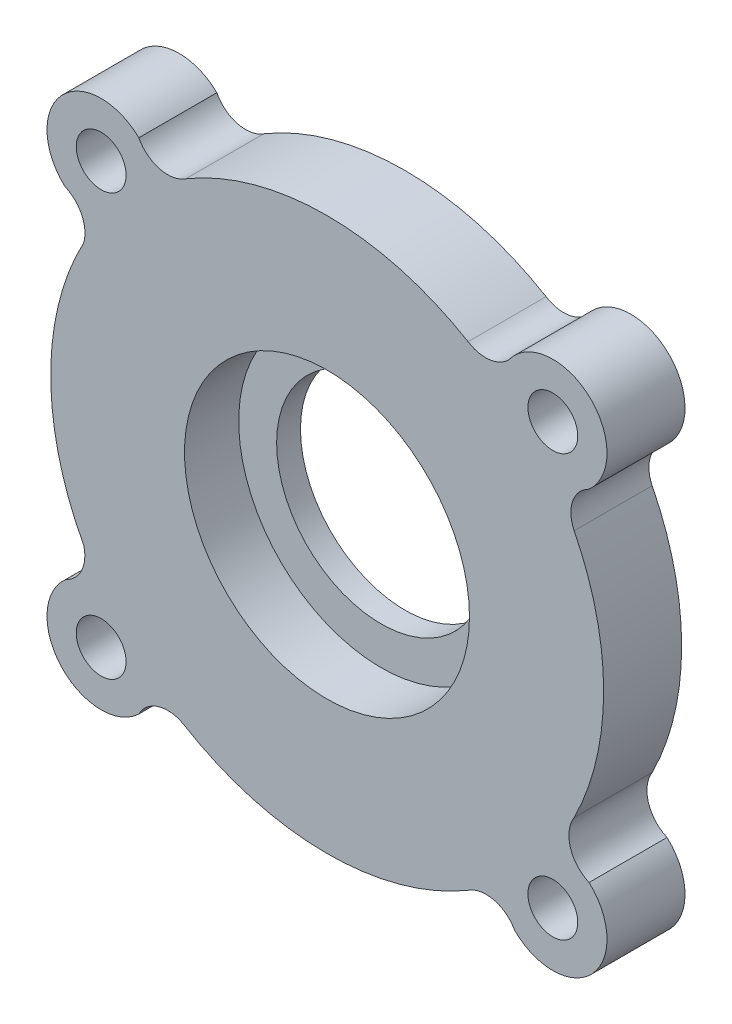
ISO-10303-21;
HEADER;
FILE_DESCRIPTION(('STEP AP214'),'2;1');
FILE_NAME('part.step','',(''),(''),'','','');
FILE_SCHEMA(('AUTOMOTIVE_DESIGN { 1 0 10303 214 1 1 1 1 }'));
ENDSEC;
DATA;
#1=APPLICATION_CONTEXT('core data for automotive mechanical design processes');
#2=APPLICATION_PROTOCOL_DEFINITION('international standard','automotive_design',2000,#1);
#3=PRODUCT_CONTEXT('',#1,'mechanical');
#4=PRODUCT('Part','Part','',(#3));
#5=PRODUCT_RELATED_PRODUCT_CATEGORY('part','',(#4));
#6=PRODUCT_DEFINITION_FORMATION('','',#4);
#7=PRODUCT_DEFINITION_CONTEXT('part definition',#1,'design');
#8=PRODUCT_DEFINITION('design','',#6,#7);
#9=PRODUCT_DEFINITION_SHAPE('','',#8);
#10=(LENGTH_UNIT() NAMED_UNIT(*) SI_UNIT(.MILLI.,.METRE.));
#11=(NAMED_UNIT(*) PLANE_ANGLE_UNIT() SI_UNIT($,.RADIAN.));
#12=(NAMED_UNIT(*) SI_UNIT($,.STERADIAN.) SOLID_ANGLE_UNIT());
#13=UNCERTAINTY_MEASURE_WITH_UNIT(LENGTH_MEASURE(1.E-05),#10,'distance_accuracy_value','');
#14=(GEOMETRIC_REPRESENTATION_CONTEXT(3) GLOBAL_UNCERTAINTY_ASSIGNED_CONTEXT((#13)) GLOBAL_UNIT_ASSIGNED_CONTEXT((#10,
#11,#12)) REPRESENTATION_CONTEXT('',''));
#15=CARTESIAN_POINT('',(0.,0.,0.));
#16=DIRECTION('',(0.,0.,1.));
#17=DIRECTION('',(1.,0.,0.));
#18=AXIS2_PLACEMENT_3D('',#15,#16,#17);
#19=CARTESIAN_POINT('',(0.,0.,7.2));
#20=DIRECTION('',(0.,0.,-1.));
#21=DIRECTION('',(-1.,0.,0.));
#22=AXIS2_PLACEMENT_3D('',#19,#20,#21);
#23=CYLINDRICAL_SURFACE('',#22,9.65);
#24=CARTESIAN_POINT('',(0.,0.,0.));
#25=DIRECTION('',(0.,0.,1.));
#26=DIRECTION('',(1.,0.,0.));
#27=AXIS2_PLACEMENT_3D('',#24,#25,#26);
#28=CIRCLE('',#27,9.65);
#29=CARTESIAN_POINT('',(9.65,0.,0.));
#30=VERTEX_POINT('',#29);
#31=EDGE_CURVE('E184',#30,#30,#28,.T.);
#32=ORIENTED_EDGE('',*,*,#31,.F.);
#33=EDGE_LOOP('',(#32));
#34=FACE_BOUND('',#33,.T.);
#35=CARTESIAN_POINT('',(0.,0.,2.2));
#36=DIRECTION('',(0.,0.,1.));
#37=DIRECTION('',(1.,0.,0.));
#38=AXIS2_PLACEMENT_3D('',#35,#36,#37);
#39=CIRCLE('',#38,9.65);
#40=CARTESIAN_POINT('',(9.65,0.,2.2));
#41=VERTEX_POINT('',#40);
#42=EDGE_CURVE('E37',#41,#41,#39,.T.);
#43=ORIENTED_EDGE('',*,*,#42,.T.);
#44=EDGE_LOOP('',(#43));
#45=FACE_BOUND('',#44,.T.);
#46=ADVANCED_FACE('F33',(#34,#45),#23,.F.);
#47=CARTESIAN_POINT('',(7.34276443322438,-12.2103392874891,7.2));
#48=DIRECTION('',(0.,0.,1.));
#49=DIRECTION('',(1.,0.,0.));
#50=AXIS2_PLACEMENT_3D('',#47,#48,#49);
#51=PLANE('',#50);
#52=CARTESIAN_POINT('',(0.,0.,7.2));
#53=DIRECTION('',(0.,0.,1.));
#54=DIRECTION('',(1.,0.,0.));
#55=AXIS2_PLACEMENT_3D('',#52,#53,#54);
#56=CIRCLE('',#55,13.15);
#57=CARTESIAN_POINT('',(13.15,0.,7.2));
#58=VERTEX_POINT('',#57);
#59=EDGE_CURVE('E457',#58,#58,#56,.T.);
#60=ORIENTED_EDGE('',*,*,#59,.F.);
#61=EDGE_LOOP('',(#60));
#62=FACE_BOUND('',#61,.T.);
#63=CARTESIAN_POINT('',(20.8435804961464,19.4369532617811,7.2));
#64=DIRECTION('',(0.,0.,1.));
#65=DIRECTION('',(1.,0.,0.));
#66=AXIS2_PLACEMENT_3D('',#63,#64,#65);
#67=CIRCLE('',#66,2.3);
#68=CARTESIAN_POINT('',(23.1435804961464,19.4369532617811,7.2));
#69=VERTEX_POINT('',#68);
#70=EDGE_CURVE('E469',#69,#69,#67,.T.);
#71=ORIENTED_EDGE('',*,*,#70,.F.);
#72=EDGE_LOOP('',(#71));
#73=FACE_BOUND('',#72,.T.);
#74=CARTESIAN_POINT('',(-20.8435804961464,-19.4369532617812,7.2));
#75=DIRECTION('',(0.,0.,1.));
#76=DIRECTION('',(1.,0.,0.));
#77=AXIS2_PLACEMENT_3D('',#74,#75,#76);
#78=CIRCLE('',#77,2.3);
#79=CARTESIAN_POINT('',(-18.5435804961464,-19.4369532617812,7.2));
#80=VERTEX_POINT('',#79);
#81=EDGE_CURVE('E481',#80,#80,#78,.T.);
#82=ORIENTED_EDGE('',*,*,#81,.F.);
#83=EDGE_LOOP('',(#82));
#84=FACE_BOUND('',#83,.T.);
#85=CARTESIAN_POINT('',(14.6855288664488,-24.4206785749781,7.2));
#86=DIRECTION('',(0.,0.,-1.));
#87=DIRECTION('',(1.,0.,0.));
#88=AXIS2_PLACEMENT_3D('',#85,#86,#87);
#89=CIRCLE('',#88,2.99999999999999);
#90=CARTESIAN_POINT('',(13.019103812311,-21.9260788998915,7.2));
#91=VERTEX_POINT('',#90);
#92=CARTESIAN_POINT('',(17.3186178935602,-22.9830269567808,7.2));
#93=VERTEX_POINT('',#92);
#94=EDGE_CURVE('E211',#91,#93,#89,.T.);
#95=ORIENTED_EDGE('',*,*,#94,.T.);
#96=CARTESIAN_POINT('',(20.8435804961464,-19.4369532617811,7.2));
#97=DIRECTION('',(0.,0.,1.));
#98=DIRECTION('',(1.,0.,0.));
#99=AXIS2_PLACEMENT_3D('',#96,#97,#98);
#100=CIRCLE('',#99,5.);
#101=CARTESIAN_POINT('',(24.1865219147143,-15.718789377278,7.2));
#102=VERTEX_POINT('',#101);
#103=EDGE_CURVE('E118',#93,#102,#100,.T.);
#104=ORIENTED_EDGE('',*,*,#103,.T.);
#105=CARTESIAN_POINT('',(25.4243940156176,-12.8782836177276,7.2));
#106=DIRECTION('',(0.,0.,-1.));
#107=DIRECTION('',(1.,0.,0.));
#108=AXIS2_PLACEMENT_3D('',#105,#106,#107);
#109=CIRCLE('',#108,3.09851582346032);
#110=CARTESIAN_POINT('',(22.8142136143577,-11.2086253948829,7.2));
#111=VERTEX_POINT('',#110);
#112=EDGE_CURVE('E251',#102,#111,#109,.T.);
#113=ORIENTED_EDGE('',*,*,#112,.T.);
#114=CARTESIAN_POINT('',(0.0333787674098179,0.249278587787173,7.2));
#115=DIRECTION('',(0.,0.,1.));
#116=DIRECTION('',(1.,0.,0.));
#117=AXIS2_PLACEMENT_3D('',#114,#115,#116);
#118=CIRCLE('',#117,25.5);
#119=CARTESIAN_POINT('',(22.8142136143577,11.7071825704573,7.2));
#120=VERTEX_POINT('',#119);
#121=EDGE_CURVE('E270',#111,#120,#118,.T.);
#122=ORIENTED_EDGE('',*,*,#121,.T.);
#123=CARTESIAN_POINT('',(25.5088228942053,13.0259247093756,7.2));
#124=DIRECTION('',(0.,0.,-1.));
#125=DIRECTION('',(1.,0.,0.));
#126=AXIS2_PLACEMENT_3D('',#123,#124,#125);
#127=CIRCLE('',#126,3.);
#128=CARTESIAN_POINT('',(24.1865219147143,15.718789377278,7.2));
#129=VERTEX_POINT('',#128);
#130=EDGE_CURVE('E267',#120,#129,#127,.T.);
#131=ORIENTED_EDGE('',*,*,#130,.T.);
#132=CARTESIAN_POINT('',(20.8435804961464,19.4369532617811,7.2));
#133=DIRECTION('',(0.,0.,1.));
#134=DIRECTION('',(1.,0.,0.));
#135=AXIS2_PLACEMENT_3D('',#132,#133,#134);
#136=CIRCLE('',#135,5.);
#137=CARTESIAN_POINT('',(16.8008499698837,22.3791174128821,7.2));
#138=VERTEX_POINT('',#137);
#139=EDGE_CURVE('E269',#129,#138,#136,.T.);
#140=ORIENTED_EDGE('',*,*,#139,.T.);
#141=CARTESIAN_POINT('',(14.6342566466709,24.4541772606479,7.2));
#142=DIRECTION('',(0.,0.,-1.));
#143=DIRECTION('',(1.,0.,0.));
#144=AXIS2_PLACEMENT_3D('',#141,#142,#143);
#145=CIRCLE('',#144,3.);
#146=CARTESIAN_POINT('',(13.019103812311,21.9260788998915,7.2));
#147=VERTEX_POINT('',#146);
#148=EDGE_CURVE('E272',#138,#147,#145,.T.);
#149=ORIENTED_EDGE('',*,*,#148,.T.);
#150=CARTESIAN_POINT('',(0.,0.,7.2));
#151=DIRECTION('',(0.,0.,1.));
#152=DIRECTION('',(1.,0.,0.));
#153=AXIS2_PLACEMENT_3D('',#150,#151,#152);
#154=CIRCLE('',#153,25.5);
#155=CARTESIAN_POINT('',(-13.019103812311,21.9260788998915,7.2));
#156=VERTEX_POINT('',#155);
#157=EDGE_CURVE('E278',#147,#156,#154,.T.);
#158=ORIENTED_EDGE('',*,*,#157,.T.);
#159=CARTESIAN_POINT('',(-14.7028304548348,24.4090337108488,7.2));
#160=DIRECTION('',(0.,0.,-1.));
#161=DIRECTION('',(1.,0.,0.));
#162=AXIS2_PLACEMENT_3D('',#159,#160,#161);
#163=CIRCLE('',#162,3.);
#164=CARTESIAN_POINT('',(-17.3676656772842,23.0311174444548,7.2));
#165=VERTEX_POINT('',#164);
#166=EDGE_CURVE('E280',#156,#165,#163,.T.);
#167=ORIENTED_EDGE('',*,*,#166,.T.);
#168=CARTESIAN_POINT('',(-20.8435804961464,19.4369532617812,7.2));
#169=DIRECTION('',(0.,0.,1.));
#170=DIRECTION('',(1.,0.,0.));
#171=AXIS2_PLACEMENT_3D('',#168,#169,#170);
#172=CIRCLE('',#171,5.);
#173=CARTESIAN_POINT('',(-24.1865219147143,15.718789377278,7.2));
#174=VERTEX_POINT('',#173);
#175=EDGE_CURVE('E282',#165,#174,#172,.T.);
#176=ORIENTED_EDGE('',*,*,#175,.T.);
#177=CARTESIAN_POINT('',(-25.3744565513042,12.923659066414,7.2));
#178=DIRECTION('',(0.,0.,-1.));
#179=DIRECTION('',(1.,0.,0.));
#180=AXIS2_PLACEMENT_3D('',#177,#178,#179);
#181=CIRCLE('',#180,3.03709436065472);
#182=CARTESIAN_POINT('',(-22.4565926968816,12.0810365634065,7.2));
#183=VERTEX_POINT('',#182);
#184=EDGE_CURVE('E284',#174,#183,#181,.T.);
#185=ORIENTED_EDGE('',*,*,#184,.T.);
#186=CARTESIAN_POINT('',(0.,0.,7.2));
#187=DIRECTION('',(0.,0.,1.));
#188=DIRECTION('',(1.,0.,0.));
#189=AXIS2_PLACEMENT_3D('',#186,#187,#188);
#190=CIRCLE('',#189,25.5);
#191=CARTESIAN_POINT('',(-22.456852874275,-12.0805529253907,7.2));
#192=VERTEX_POINT('',#191);
#193=EDGE_CURVE('E286',#183,#192,#190,.T.);
#194=ORIENTED_EDGE('',*,*,#193,.T.);
#195=CARTESIAN_POINT('',(-25.4243940156176,-12.8782836177276,7.2));
#196=DIRECTION('',(0.,0.,-1.));
#197=DIRECTION('',(1.,0.,0.));
#198=AXIS2_PLACEMENT_3D('',#195,#196,#197);
#199=CIRCLE('',#198,3.07289353591315);
#200=CARTESIAN_POINT('',(-24.1213788812351,-15.6612364097503,7.2));
#201=VERTEX_POINT('',#200);
#202=EDGE_CURVE('E162',#192,#201,#199,.T.);
#203=ORIENTED_EDGE('',*,*,#202,.T.);
#204=CARTESIAN_POINT('',(-20.8435804961464,-19.4369532617812,7.2));
#205=DIRECTION('',(0.,0.,1.));
#206=DIRECTION('',(1.,0.,0.));
#207=AXIS2_PLACEMENT_3D('',#204,#205,#206);
#208=CIRCLE('',#207,5.);
#209=CARTESIAN_POINT('',(-17.3676656772842,-23.0311174444548,7.2));
#210=VERTEX_POINT('',#209);
#211=EDGE_CURVE('E155',#201,#210,#208,.T.);
#212=ORIENTED_EDGE('',*,*,#211,.T.);
#213=CARTESIAN_POINT('',(-14.7040312563286,-24.4113535371219,7.2));
#214=DIRECTION('',(0.,0.,-1.));
#215=DIRECTION('',(1.,0.,0.));
#216=AXIS2_PLACEMENT_3D('',#213,#214,#215);
#217=CIRCLE('',#216,3.);
#218=CARTESIAN_POINT('',(-13.2509251729815,-21.7867616239781,7.2));
#219=VERTEX_POINT('',#218);
#220=EDGE_CURVE('E160',#210,#219,#217,.T.);
#221=ORIENTED_EDGE('',*,*,#220,.T.);
#222=CARTESIAN_POINT('',(0.,0.,7.2));
#223=DIRECTION('',(0.,0.,1.));
#224=DIRECTION('',(1.,0.,0.));
#225=AXIS2_PLACEMENT_3D('',#222,#223,#224);
#226=CIRCLE('',#225,25.5);
#227=EDGE_CURVE('E51',#219,#91,#226,.T.);
#228=ORIENTED_EDGE('',*,*,#227,.T.);
#229=EDGE_LOOP('',(#95,#104,#113,#122,#131,#140,#149,#158,#167,#176,#185,#194,#203,#212,#221,#228));
#230=FACE_BOUND('',#229,.T.);
#231=CARTESIAN_POINT('',(20.8435804961464,-19.4369532617811,7.2));
#232=DIRECTION('',(0.,0.,1.));
#233=DIRECTION('',(1.,0.,0.));
#234=AXIS2_PLACEMENT_3D('',#231,#232,#233);
#235=CIRCLE('',#234,2.3);
#236=CARTESIAN_POINT('',(23.1435804961464,-19.4369532617811,7.2));
#237=VERTEX_POINT('',#236);
#238=EDGE_CURVE('E475',#237,#237,#235,.T.);
#239=ORIENTED_EDGE('',*,*,#238,.F.);
#240=EDGE_LOOP('',(#239));
#241=FACE_BOUND('',#240,.T.);
#242=CARTESIAN_POINT('',(-20.8435804961464,19.4369532617812,7.2));
#243=DIRECTION('',(0.,0.,1.));
#244=DIRECTION('',(1.,0.,0.));
#245=AXIS2_PLACEMENT_3D('',#242,#243,#244);
#246=CIRCLE('',#245,2.3);
#247=CARTESIAN_POINT('',(-18.5435804961464,19.4369532617812,7.2));
#248=VERTEX_POINT('',#247);
#249=EDGE_CURVE('E463',#248,#248,#246,.T.);
#250=ORIENTED_EDGE('',*,*,#249,.F.);
#251=EDGE_LOOP('',(#250));
#252=FACE_BOUND('',#251,.T.);
#253=ADVANCED_FACE('F157',(#62,#73,#84,#230,#241,#252),#51,.T.);
#254=CARTESIAN_POINT('',(7.34276443322438,-12.2103392874891,0.));
#255=DIRECTION('',(0.,0.,1.));
#256=DIRECTION('',(1.,0.,0.));
#257=AXIS2_PLACEMENT_3D('',#254,#255,#256);
#258=PLANE('',#257);
#259=CARTESIAN_POINT('',(14.6855288664488,-24.4206785749781,0.));
#260=DIRECTION('',(0.,0.,-1.));
#261=DIRECTION('',(1.,0.,0.));
#262=AXIS2_PLACEMENT_3D('',#259,#260,#261);
#263=CIRCLE('',#262,2.99999999999999);
#264=CARTESIAN_POINT('',(13.019103812311,-21.9260788998915,0.));
#265=VERTEX_POINT('',#264);
#266=CARTESIAN_POINT('',(17.3186178935602,-22.9830269567808,0.));
#267=VERTEX_POINT('',#266);
#268=EDGE_CURVE('E180',#265,#267,#263,.T.);
#269=ORIENTED_EDGE('',*,*,#268,.F.);
#270=CARTESIAN_POINT('',(0.,0.,0.));
#271=DIRECTION('',(0.,0.,1.));
#272=DIRECTION('',(1.,0.,0.));
#273=AXIS2_PLACEMENT_3D('',#270,#271,#272);
#274=CIRCLE('',#273,25.5);
#275=CARTESIAN_POINT('',(-13.2509251729815,-21.7867616239781,0.));
#276=VERTEX_POINT('',#275);
#277=EDGE_CURVE('E110',#276,#265,#274,.T.);
#278=ORIENTED_EDGE('',*,*,#277,.F.);
#279=CARTESIAN_POINT('',(-14.7040312563286,-24.4113535371219,0.));
#280=DIRECTION('',(0.,0.,-1.));
#281=DIRECTION('',(1.,0.,0.));
#282=AXIS2_PLACEMENT_3D('',#279,#280,#281);
#283=CIRCLE('',#282,3.);
#284=CARTESIAN_POINT('',(-17.3676656772842,-23.0311174444548,0.));
#285=VERTEX_POINT('',#284);
#286=EDGE_CURVE('E104',#285,#276,#283,.T.);
#287=ORIENTED_EDGE('',*,*,#286,.F.);
#288=CARTESIAN_POINT('',(-20.8435804961464,-19.4369532617812,0.));
#289=DIRECTION('',(0.,0.,1.));
#290=DIRECTION('',(1.,0.,0.));
#291=AXIS2_PLACEMENT_3D('',#288,#289,#290);
#292=CIRCLE('',#291,5.);
#293=CARTESIAN_POINT('',(-24.1213788812351,-15.6612364097503,0.));
#294=VERTEX_POINT('',#293);
#295=EDGE_CURVE('E170',#294,#285,#292,.T.);
#296=ORIENTED_EDGE('',*,*,#295,.F.);
#297=CARTESIAN_POINT('',(-25.4243940156176,-12.8782836177276,0.));
#298=DIRECTION('',(0.,0.,-1.));
#299=DIRECTION('',(1.,0.,0.));
#300=AXIS2_PLACEMENT_3D('',#297,#298,#299);
#301=CIRCLE('',#300,3.07289353591315);
#302=CARTESIAN_POINT('',(-22.456852874275,-12.0805529253907,0.));
#303=VERTEX_POINT('',#302);
#304=EDGE_CURVE('E206',#303,#294,#301,.T.);
#305=ORIENTED_EDGE('',*,*,#304,.F.);
#306=CARTESIAN_POINT('',(0.,0.,0.));
#307=DIRECTION('',(0.,0.,1.));
#308=DIRECTION('',(1.,0.,0.));
#309=AXIS2_PLACEMENT_3D('',#306,#307,#308);
#310=CIRCLE('',#309,25.5);
#311=CARTESIAN_POINT('',(-22.4565926968816,12.0810365634065,0.));
#312=VERTEX_POINT('',#311);
#313=EDGE_CURVE('E204',#312,#303,#310,.T.);
#314=ORIENTED_EDGE('',*,*,#313,.F.);
#315=CARTESIAN_POINT('',(-25.3744565513042,12.923659066414,0.));
#316=DIRECTION('',(0.,0.,-1.));
#317=DIRECTION('',(1.,0.,0.));
#318=AXIS2_PLACEMENT_3D('',#315,#316,#317);
#319=CIRCLE('',#318,3.03709436065472);
#320=CARTESIAN_POINT('',(-24.1865219147143,15.718789377278,0.));
#321=VERTEX_POINT('',#320);
#322=EDGE_CURVE('E202',#321,#312,#319,.T.);
#323=ORIENTED_EDGE('',*,*,#322,.F.);
#324=CARTESIAN_POINT('',(-20.8435804961464,19.4369532617812,0.));
#325=DIRECTION('',(0.,0.,1.));
#326=DIRECTION('',(1.,0.,0.));
#327=AXIS2_PLACEMENT_3D('',#324,#325,#326);
#328=CIRCLE('',#327,5.);
#329=CARTESIAN_POINT('',(-17.3676656772842,23.0311174444548,0.));
#330=VERTEX_POINT('',#329);
#331=EDGE_CURVE('E200',#330,#321,#328,.T.);
#332=ORIENTED_EDGE('',*,*,#331,.F.);
#333=CARTESIAN_POINT('',(-14.7028304548348,24.4090337108488,0.));
#334=DIRECTION('',(0.,0.,-1.));
#335=DIRECTION('',(1.,0.,0.));
#336=AXIS2_PLACEMENT_3D('',#333,#334,#335);
#337=CIRCLE('',#336,3.);
#338=CARTESIAN_POINT('',(-13.019103812311,21.9260788998915,0.));
#339=VERTEX_POINT('',#338);
#340=EDGE_CURVE('E198',#339,#330,#337,.T.);
#341=ORIENTED_EDGE('',*,*,#340,.F.);
#342=CARTESIAN_POINT('',(0.,0.,0.));
#343=DIRECTION('',(0.,0.,1.));
#344=DIRECTION('',(1.,0.,0.));
#345=AXIS2_PLACEMENT_3D('',#342,#343,#344);
#346=CIRCLE('',#345,25.5);
#347=CARTESIAN_POINT('',(13.019103812311,21.9260788998915,0.));
#348=VERTEX_POINT('',#347);
#349=EDGE_CURVE('E196',#348,#339,#346,.T.);
#350=ORIENTED_EDGE('',*,*,#349,.F.);
#351=CARTESIAN_POINT('',(14.6342566466709,24.4541772606479,0.));
#352=DIRECTION('',(0.,0.,-1.));
#353=DIRECTION('',(1.,0.,0.));
#354=AXIS2_PLACEMENT_3D('',#351,#352,#353);
#355=CIRCLE('',#354,3.);
#356=CARTESIAN_POINT('',(16.8008499698837,22.3791174128821,0.));
#357=VERTEX_POINT('',#356);
#358=EDGE_CURVE('E194',#357,#348,#355,.T.);
#359=ORIENTED_EDGE('',*,*,#358,.F.);
#360=CARTESIAN_POINT('',(20.8435804961464,19.4369532617811,0.));
#361=DIRECTION('',(0.,0.,1.));
#362=DIRECTION('',(1.,0.,0.));
#363=AXIS2_PLACEMENT_3D('',#360,#361,#362);
#364=CIRCLE('',#363,5.);
#365=CARTESIAN_POINT('',(24.1865219147143,15.718789377278,0.));
#366=VERTEX_POINT('',#365);
#367=EDGE_CURVE('E192',#366,#357,#364,.T.);
#368=ORIENTED_EDGE('',*,*,#367,.F.);
#369=CARTESIAN_POINT('',(25.5088228942053,13.0259247093756,0.));
#370=DIRECTION('',(0.,0.,-1.));
#371=DIRECTION('',(1.,0.,0.));
#372=AXIS2_PLACEMENT_3D('',#369,#370,#371);
#373=CIRCLE('',#372,3.);
#374=CARTESIAN_POINT('',(22.8142136143577,11.7071825704573,0.));
#375=VERTEX_POINT('',#374);
#376=EDGE_CURVE('E190',#375,#366,#373,.T.);
#377=ORIENTED_EDGE('',*,*,#376,.F.);
#378=CARTESIAN_POINT('',(0.0333787674098179,0.249278587787173,0.));
#379=DIRECTION('',(0.,0.,1.));
#380=DIRECTION('',(1.,0.,0.));
#381=AXIS2_PLACEMENT_3D('',#378,#379,#380);
#382=CIRCLE('',#381,25.5);
#383=CARTESIAN_POINT('',(22.8142136143577,-11.2086253948829,0.));
#384=VERTEX_POINT('',#383);
#385=EDGE_CURVE('E188',#384,#375,#382,.T.);
#386=ORIENTED_EDGE('',*,*,#385,.F.);
#387=CARTESIAN_POINT('',(25.4243940156176,-12.8782836177276,0.));
#388=DIRECTION('',(0.,0.,-1.));
#389=DIRECTION('',(1.,0.,0.));
#390=AXIS2_PLACEMENT_3D('',#387,#388,#389);
#391=CIRCLE('',#390,3.09851582346032);
#392=CARTESIAN_POINT('',(24.1865219147143,-15.718789377278,0.));
#393=VERTEX_POINT('',#392);
#394=EDGE_CURVE('E186',#393,#384,#391,.T.);
#395=ORIENTED_EDGE('',*,*,#394,.F.);
#396=CARTESIAN_POINT('',(20.8435804961464,-19.4369532617811,0.));
#397=DIRECTION('',(0.,0.,1.));
#398=DIRECTION('',(1.,0.,0.));
#399=AXIS2_PLACEMENT_3D('',#396,#397,#398);
#400=CIRCLE('',#399,5.);
#401=EDGE_CURVE('E183',#267,#393,#400,.T.);
#402=ORIENTED_EDGE('',*,*,#401,.F.);
#403=EDGE_LOOP('',(#269,#278,#287,#296,#305,#314,#323,#332,#341,#350,#359,#368,#377,#386,#395,#402));
#404=FACE_BOUND('',#403,.T.);
#405=ORIENTED_EDGE('',*,*,#31,.T.);
#406=EDGE_LOOP('',(#405));
#407=FACE_BOUND('',#406,.T.);
#408=CARTESIAN_POINT('',(-20.8435804961464,-19.4369532617812,0.));
#409=DIRECTION('',(0.,0.,1.));
#410=DIRECTION('',(1.,0.,0.));
#411=AXIS2_PLACEMENT_3D('',#408,#409,#410);
#412=CIRCLE('',#411,2.3);
#413=CARTESIAN_POINT('',(-18.5435804961464,-19.4369532617812,0.));
#414=VERTEX_POINT('',#413);
#415=EDGE_CURVE('E478',#414,#414,#412,.T.);
#416=ORIENTED_EDGE('',*,*,#415,.T.);
#417=EDGE_LOOP('',(#416));
#418=FACE_BOUND('',#417,.T.);
#419=CARTESIAN_POINT('',(20.8435804961464,-19.4369532617811,0.));
#420=DIRECTION('',(0.,0.,1.));
#421=DIRECTION('',(1.,0.,0.));
#422=AXIS2_PLACEMENT_3D('',#419,#420,#421);
#423=CIRCLE('',#422,2.3);
#424=CARTESIAN_POINT('',(23.1435804961464,-19.4369532617811,0.));
#425=VERTEX_POINT('',#424);
#426=EDGE_CURVE('E472',#425,#425,#423,.T.);
#427=ORIENTED_EDGE('',*,*,#426,.T.);
#428=EDGE_LOOP('',(#427));
#429=FACE_BOUND('',#428,.T.);
#430=CARTESIAN_POINT('',(20.8435804961464,19.4369532617811,0.));
#431=DIRECTION('',(0.,0.,1.));
#432=DIRECTION('',(1.,0.,0.));
#433=AXIS2_PLACEMENT_3D('',#430,#431,#432);
#434=CIRCLE('',#433,2.3);
#435=CARTESIAN_POINT('',(23.1435804961464,19.4369532617811,0.));
#436=VERTEX_POINT('',#435);
#437=EDGE_CURVE('E466',#436,#436,#434,.T.);
#438=ORIENTED_EDGE('',*,*,#437,.T.);
#439=EDGE_LOOP('',(#438));
#440=FACE_BOUND('',#439,.T.);
#441=CARTESIAN_POINT('',(-20.8435804961464,19.4369532617812,0.));
#442=DIRECTION('',(0.,0.,1.));
#443=DIRECTION('',(1.,0.,0.));
#444=AXIS2_PLACEMENT_3D('',#441,#442,#443);
#445=CIRCLE('',#444,2.3);
#446=CARTESIAN_POINT('',(-18.5435804961464,19.4369532617812,0.));
#447=VERTEX_POINT('',#446);
#448=EDGE_CURVE('E459',#447,#447,#445,.T.);
#449=ORIENTED_EDGE('',*,*,#448,.T.);
#450=EDGE_LOOP('',(#449));
#451=FACE_BOUND('',#450,.T.);
#452=ADVANCED_FACE('F255',(#404,#407,#418,#429,#440,#451),#258,.F.);
#453=CARTESIAN_POINT('',(14.6855288664488,-24.4206785749781,7.2));
#454=DIRECTION('',(0.,0.,-1.));
#455=DIRECTION('',(-1.,0.,0.));
#456=AXIS2_PLACEMENT_3D('',#453,#454,#455);
#457=CYLINDRICAL_SURFACE('',#456,2.99999999999999);
#458=ORIENTED_EDGE('',*,*,#268,.T.);
#459=DIRECTION('',(0.,0.,-1.));
#460=VECTOR('',#459,1.);
#461=CARTESIAN_POINT('',(17.3186178935602,-22.9830269567808,7.2));
#462=LINE('',#461,#460);
#463=EDGE_CURVE('E11',#93,#267,#462,.T.);
#464=ORIENTED_EDGE('',*,*,#463,.F.);
#465=ORIENTED_EDGE('',*,*,#94,.F.);
#466=DIRECTION('',(0.,0.,-1.));
#467=VECTOR('',#466,1.);
#468=CARTESIAN_POINT('',(13.019103812311,-21.9260788998915,7.2));
#469=LINE('',#468,#467);
#470=EDGE_CURVE('E176',#91,#265,#469,.T.);
#471=ORIENTED_EDGE('',*,*,#470,.T.);
#472=EDGE_LOOP('',(#458,#464,#465,#471));
#473=FACE_BOUND('',#472,.T.);
#474=ADVANCED_FACE('F35',(#473),#457,.F.);
#475=CARTESIAN_POINT('',(20.8435804961464,-19.4369532617811,7.2));
#476=DIRECTION('',(0.,0.,-1.));
#477=DIRECTION('',(-1.,0.,0.));
#478=AXIS2_PLACEMENT_3D('',#475,#476,#477);
#479=CYLINDRICAL_SURFACE('',#478,5.);
#480=ORIENTED_EDGE('',*,*,#401,.T.);
#481=DIRECTION('',(0.,0.,-1.));
#482=VECTOR('',#481,1.);
#483=CARTESIAN_POINT('',(24.1865219147143,-15.718789377278,7.2));
#484=LINE('',#483,#482);
#485=EDGE_CURVE('E43',#102,#393,#484,.T.);
#486=ORIENTED_EDGE('',*,*,#485,.F.);
#487=ORIENTED_EDGE('',*,*,#103,.F.);
#488=ORIENTED_EDGE('',*,*,#463,.T.);
#489=EDGE_LOOP('',(#480,#486,#487,#488));
#490=FACE_BOUND('',#489,.T.);
#491=ADVANCED_FACE('F328',(#490),#479,.T.);
#492=CARTESIAN_POINT('',(25.4243940156176,-12.8782836177276,7.2));
#493=DIRECTION('',(0.,0.,-1.));
#494=DIRECTION('',(-1.,0.,0.));
#495=AXIS2_PLACEMENT_3D('',#492,#493,#494);
#496=CYLINDRICAL_SURFACE('',#495,3.09851582346032);
#497=ORIENTED_EDGE('',*,*,#394,.T.);
#498=DIRECTION('',(0.,0.,-1.));
#499=VECTOR('',#498,1.);
#500=CARTESIAN_POINT('',(22.8142136143577,-11.2086253948829,7.2));
#501=LINE('',#500,#499);
#502=EDGE_CURVE('E242',#111,#384,#501,.T.);
#503=ORIENTED_EDGE('',*,*,#502,.F.);
#504=ORIENTED_EDGE('',*,*,#112,.F.);
#505=ORIENTED_EDGE('',*,*,#485,.T.);
#506=EDGE_LOOP('',(#497,#503,#504,#505));
#507=FACE_BOUND('',#506,.T.);
#508=ADVANCED_FACE('F249',(#507),#496,.F.);
#509=CARTESIAN_POINT('',(0.0333787674098179,0.249278587787173,7.2));
#510=DIRECTION('',(0.,0.,-1.));
#511=DIRECTION('',(-1.,0.,0.));
#512=AXIS2_PLACEMENT_3D('',#509,#510,#511);
#513=CYLINDRICAL_SURFACE('',#512,25.5);
#514=ORIENTED_EDGE('',*,*,#385,.T.);
#515=DIRECTION('',(0.,0.,-1.));
#516=VECTOR('',#515,1.);
#517=CARTESIAN_POINT('',(22.8142136143577,11.7071825704573,7.2));
#518=LINE('',#517,#516);
#519=EDGE_CURVE('E239',#120,#375,#518,.T.);
#520=ORIENTED_EDGE('',*,*,#519,.F.);
#521=ORIENTED_EDGE('',*,*,#121,.F.);
#522=ORIENTED_EDGE('',*,*,#502,.T.);
#523=EDGE_LOOP('',(#514,#520,#521,#522));
#524=FACE_BOUND('',#523,.T.);
#525=ADVANCED_FACE('F261',(#524),#513,.T.);
#526=CARTESIAN_POINT('',(25.5088228942053,13.0259247093756,7.2));
#527=DIRECTION('',(0.,0.,-1.));
#528=DIRECTION('',(-1.,0.,0.));
#529=AXIS2_PLACEMENT_3D('',#526,#527,#528);
#530=CYLINDRICAL_SURFACE('',#529,3.);
#531=ORIENTED_EDGE('',*,*,#376,.T.);
#532=DIRECTION('',(0.,0.,-1.));
#533=VECTOR('',#532,1.);
#534=CARTESIAN_POINT('',(24.1865219147143,15.718789377278,7.2));
#535=LINE('',#534,#533);
#536=EDGE_CURVE('E236',#129,#366,#535,.T.);
#537=ORIENTED_EDGE('',*,*,#536,.F.);
#538=ORIENTED_EDGE('',*,*,#130,.F.);
#539=ORIENTED_EDGE('',*,*,#519,.T.);
#540=EDGE_LOOP('',(#531,#537,#538,#539));
#541=FACE_BOUND('',#540,.T.);
#542=ADVANCED_FACE('F265',(#541),#530,.F.);
#543=CARTESIAN_POINT('',(20.8435804961464,19.4369532617811,7.2));
#544=DIRECTION('',(0.,0.,-1.));
#545=DIRECTION('',(-1.,0.,0.));
#546=AXIS2_PLACEMENT_3D('',#543,#544,#545);
#547=CYLINDRICAL_SURFACE('',#546,5.);
#548=ORIENTED_EDGE('',*,*,#367,.T.);
#549=DIRECTION('',(0.,0.,-1.));
#550=VECTOR('',#549,1.);
#551=CARTESIAN_POINT('',(16.8008499698837,22.3791174128821,7.2));
#552=LINE('',#551,#550);
#553=EDGE_CURVE('E233',#138,#357,#552,.T.);
#554=ORIENTED_EDGE('',*,*,#553,.F.);
#555=ORIENTED_EDGE('',*,*,#139,.F.);
#556=ORIENTED_EDGE('',*,*,#536,.T.);
#557=EDGE_LOOP('',(#548,#554,#555,#556));
#558=FACE_BOUND('',#557,.T.);
#559=ADVANCED_FACE('F341',(#558),#547,.T.);
#560=CARTESIAN_POINT('',(14.6342566466709,24.4541772606479,7.2));
#561=DIRECTION('',(0.,0.,-1.));
#562=DIRECTION('',(-1.,0.,0.));
#563=AXIS2_PLACEMENT_3D('',#560,#561,#562);
#564=CYLINDRICAL_SURFACE('',#563,3.);
#565=ORIENTED_EDGE('',*,*,#358,.T.);
#566=DIRECTION('',(0.,0.,-1.));
#567=VECTOR('',#566,1.);
#568=CARTESIAN_POINT('',(13.019103812311,21.9260788998915,7.2));
#569=LINE('',#568,#567);
#570=EDGE_CURVE('E230',#147,#348,#569,.T.);
#571=ORIENTED_EDGE('',*,*,#570,.F.);
#572=ORIENTED_EDGE('',*,*,#148,.F.);
#573=ORIENTED_EDGE('',*,*,#553,.T.);
#574=EDGE_LOOP('',(#565,#571,#572,#573));
#575=FACE_BOUND('',#574,.T.);
#576=ADVANCED_FACE('F344',(#575),#564,.F.);
#577=CARTESIAN_POINT('',(0.,0.,7.2));
#578=DIRECTION('',(0.,0.,-1.));
#579=DIRECTION('',(-1.,0.,0.));
#580=AXIS2_PLACEMENT_3D('',#577,#578,#579);
#581=CYLINDRICAL_SURFACE('',#580,25.5);
#582=ORIENTED_EDGE('',*,*,#349,.T.);
#583=DIRECTION('',(0.,0.,-1.));
#584=VECTOR('',#583,1.);
#585=CARTESIAN_POINT('',(-13.019103812311,21.9260788998915,7.2));
#586=LINE('',#585,#584);
#587=EDGE_CURVE('E227',#156,#339,#586,.T.);
#588=ORIENTED_EDGE('',*,*,#587,.F.);
#589=ORIENTED_EDGE('',*,*,#157,.F.);
#590=ORIENTED_EDGE('',*,*,#570,.T.);
#591=EDGE_LOOP('',(#582,#588,#589,#590));
#592=FACE_BOUND('',#591,.T.);
#593=ADVANCED_FACE('F348',(#592),#581,.T.);
#594=CARTESIAN_POINT('',(-14.7028304548348,24.4090337108488,7.2));
#595=DIRECTION('',(0.,0.,-1.));
#596=DIRECTION('',(-1.,0.,0.));
#597=AXIS2_PLACEMENT_3D('',#594,#595,#596);
#598=CYLINDRICAL_SURFACE('',#597,3.);
#599=ORIENTED_EDGE('',*,*,#340,.T.);
#600=DIRECTION('',(0.,0.,-1.));
#601=VECTOR('',#600,1.);
#602=CARTESIAN_POINT('',(-17.3676656772842,23.0311174444548,7.2));
#603=LINE('',#602,#601);
#604=EDGE_CURVE('E224',#165,#330,#603,.T.);
#605=ORIENTED_EDGE('',*,*,#604,.F.);
#606=ORIENTED_EDGE('',*,*,#166,.F.);
#607=ORIENTED_EDGE('',*,*,#587,.T.);
#608=EDGE_LOOP('',(#599,#605,#606,#607));
#609=FACE_BOUND('',#608,.T.);
#610=ADVANCED_FACE('F352',(#609),#598,.F.);
#611=CARTESIAN_POINT('',(-20.8435804961464,19.4369532617812,7.2));
#612=DIRECTION('',(0.,0.,-1.));
#613=DIRECTION('',(-1.,0.,0.));
#614=AXIS2_PLACEMENT_3D('',#611,#612,#613);
#615=CYLINDRICAL_SURFACE('',#614,5.);
#616=ORIENTED_EDGE('',*,*,#331,.T.);
#617=DIRECTION('',(0.,0.,-1.));
#618=VECTOR('',#617,1.);
#619=CARTESIAN_POINT('',(-24.1865219147143,15.718789377278,7.2));
#620=LINE('',#619,#618);
#621=EDGE_CURVE('E221',#174,#321,#620,.T.);
#622=ORIENTED_EDGE('',*,*,#621,.F.);
#623=ORIENTED_EDGE('',*,*,#175,.F.);
#624=ORIENTED_EDGE('',*,*,#604,.T.);
#625=EDGE_LOOP('',(#616,#622,#623,#624));
#626=FACE_BOUND('',#625,.T.);
#627=ADVANCED_FACE('F356',(#626),#615,.T.);
#628=CARTESIAN_POINT('',(-25.3744565513042,12.923659066414,7.2));
#629=DIRECTION('',(0.,0.,-1.));
#630=DIRECTION('',(-1.,0.,0.));
#631=AXIS2_PLACEMENT_3D('',#628,#629,#630);
#632=CYLINDRICAL_SURFACE('',#631,3.03709436065472);
#633=ORIENTED_EDGE('',*,*,#322,.T.);
#634=DIRECTION('',(0.,0.,-1.));
#635=VECTOR('',#634,1.);
#636=CARTESIAN_POINT('',(-22.4565926968816,12.0810365634065,7.2));
#637=LINE('',#636,#635);
#638=EDGE_CURVE('E218',#183,#312,#637,.T.);
#639=ORIENTED_EDGE('',*,*,#638,.F.);
#640=ORIENTED_EDGE('',*,*,#184,.F.);
#641=ORIENTED_EDGE('',*,*,#621,.T.);
#642=EDGE_LOOP('',(#633,#639,#640,#641));
#643=FACE_BOUND('',#642,.T.);
#644=ADVANCED_FACE('F360',(#643),#632,.F.);
#645=CARTESIAN_POINT('',(0.,0.,7.2));
#646=DIRECTION('',(0.,0.,-1.));
#647=DIRECTION('',(-1.,0.,0.));
#648=AXIS2_PLACEMENT_3D('',#645,#646,#647);
#649=CYLINDRICAL_SURFACE('',#648,25.5);
#650=ORIENTED_EDGE('',*,*,#313,.T.);
#651=DIRECTION('',(0.,0.,-1.));
#652=VECTOR('',#651,1.);
#653=CARTESIAN_POINT('',(-22.456852874275,-12.0805529253907,7.2));
#654=LINE('',#653,#652);
#655=EDGE_CURVE('E215',#192,#303,#654,.T.);
#656=ORIENTED_EDGE('',*,*,#655,.F.);
#657=ORIENTED_EDGE('',*,*,#193,.F.);
#658=ORIENTED_EDGE('',*,*,#638,.T.);
#659=EDGE_LOOP('',(#650,#656,#657,#658));
#660=FACE_BOUND('',#659,.T.);
#661=ADVANCED_FACE('F292',(#660),#649,.T.);
#662=CARTESIAN_POINT('',(-25.4243940156176,-12.8782836177276,7.2));
#663=DIRECTION('',(0.,0.,-1.));
#664=DIRECTION('',(-1.,0.,0.));
#665=AXIS2_PLACEMENT_3D('',#662,#663,#664);
#666=CYLINDRICAL_SURFACE('',#665,3.07289353591315);
#667=ORIENTED_EDGE('',*,*,#304,.T.);
#668=DIRECTION('',(0.,0.,-1.));
#669=VECTOR('',#668,1.);
#670=CARTESIAN_POINT('',(-24.1213788812351,-15.6612364097503,7.2));
#671=LINE('',#670,#669);
#672=EDGE_CURVE('E171',#201,#294,#671,.T.);
#673=ORIENTED_EDGE('',*,*,#672,.F.);
#674=ORIENTED_EDGE('',*,*,#202,.F.);
#675=ORIENTED_EDGE('',*,*,#655,.T.);
#676=EDGE_LOOP('',(#667,#673,#674,#675));
#677=FACE_BOUND('',#676,.T.);
#678=ADVANCED_FACE('F296',(#677),#666,.F.);
#679=CARTESIAN_POINT('',(-20.8435804961464,-19.4369532617812,7.2));
#680=DIRECTION('',(0.,0.,-1.));
#681=DIRECTION('',(-1.,0.,0.));
#682=AXIS2_PLACEMENT_3D('',#679,#680,#681);
#683=CYLINDRICAL_SURFACE('',#682,5.);
#684=ORIENTED_EDGE('',*,*,#295,.T.);
#685=DIRECTION('',(0.,0.,-1.));
#686=VECTOR('',#685,1.);
#687=CARTESIAN_POINT('',(-17.3676656772842,-23.0311174444548,7.2));
#688=LINE('',#687,#686);
#689=EDGE_CURVE('E167',#210,#285,#688,.T.);
#690=ORIENTED_EDGE('',*,*,#689,.F.);
#691=ORIENTED_EDGE('',*,*,#211,.F.);
#692=ORIENTED_EDGE('',*,*,#672,.T.);
#693=EDGE_LOOP('',(#684,#690,#691,#692));
#694=FACE_BOUND('',#693,.T.);
#695=ADVANCED_FACE('F168',(#694),#683,.T.);
#696=CARTESIAN_POINT('',(-14.7040312563286,-24.4113535371219,7.2));
#697=DIRECTION('',(0.,0.,-1.));
#698=DIRECTION('',(-1.,0.,0.));
#699=AXIS2_PLACEMENT_3D('',#696,#697,#698);
#700=CYLINDRICAL_SURFACE('',#699,3.);
#701=ORIENTED_EDGE('',*,*,#286,.T.);
#702=DIRECTION('',(0.,0.,-1.));
#703=VECTOR('',#702,1.);
#704=CARTESIAN_POINT('',(-13.2509251729815,-21.7867616239781,7.2));
#705=LINE('',#704,#703);
#706=EDGE_CURVE('E172',#219,#276,#705,.T.);
#707=ORIENTED_EDGE('',*,*,#706,.F.);
#708=ORIENTED_EDGE('',*,*,#220,.F.);
#709=ORIENTED_EDGE('',*,*,#689,.T.);
#710=EDGE_LOOP('',(#701,#707,#708,#709));
#711=FACE_BOUND('',#710,.T.);
#712=ADVANCED_FACE('F174',(#711),#700,.F.);
#713=CARTESIAN_POINT('',(0.,0.,7.2));
#714=DIRECTION('',(0.,0.,-1.));
#715=DIRECTION('',(-1.,0.,0.));
#716=AXIS2_PLACEMENT_3D('',#713,#714,#715);
#717=CYLINDRICAL_SURFACE('',#716,25.5);
#718=ORIENTED_EDGE('',*,*,#277,.T.);
#719=ORIENTED_EDGE('',*,*,#470,.F.);
#720=ORIENTED_EDGE('',*,*,#227,.F.);
#721=ORIENTED_EDGE('',*,*,#706,.T.);
#722=EDGE_LOOP('',(#718,#719,#720,#721));
#723=FACE_BOUND('',#722,.T.);
#724=ADVANCED_FACE('F300',(#723),#717,.T.);
#725=CARTESIAN_POINT('',(-20.8435804961464,-19.4369532617812,7.2));
#726=DIRECTION('',(0.,0.,-1.));
#727=DIRECTION('',(-1.,0.,0.));
#728=AXIS2_PLACEMENT_3D('',#725,#726,#727);
#729=CYLINDRICAL_SURFACE('',#728,2.3);
#730=ORIENTED_EDGE('',*,*,#81,.T.);
#731=EDGE_LOOP('',(#730));
#732=FACE_BOUND('',#731,.T.);
#733=ORIENTED_EDGE('',*,*,#415,.F.);
#734=EDGE_LOOP('',(#733));
#735=FACE_BOUND('',#734,.T.);
#736=ADVANCED_FACE('F302',(#732,#735),#729,.F.);
#737=CARTESIAN_POINT('',(20.8435804961464,-19.4369532617811,7.2));
#738=DIRECTION('',(0.,0.,-1.));
#739=DIRECTION('',(-1.,0.,0.));
#740=AXIS2_PLACEMENT_3D('',#737,#738,#739);
#741=CYLINDRICAL_SURFACE('',#740,2.3);
#742=ORIENTED_EDGE('',*,*,#238,.T.);
#743=EDGE_LOOP('',(#742));
#744=FACE_BOUND('',#743,.T.);
#745=ORIENTED_EDGE('',*,*,#426,.F.);
#746=EDGE_LOOP('',(#745));
#747=FACE_BOUND('',#746,.T.);
#748=ADVANCED_FACE('F308',(#744,#747),#741,.F.);
#749=CARTESIAN_POINT('',(20.8435804961464,19.4369532617811,7.2));
#750=DIRECTION('',(0.,0.,-1.));
#751=DIRECTION('',(-1.,0.,0.));
#752=AXIS2_PLACEMENT_3D('',#749,#750,#751);
#753=CYLINDRICAL_SURFACE('',#752,2.3);
#754=ORIENTED_EDGE('',*,*,#70,.T.);
#755=EDGE_LOOP('',(#754));
#756=FACE_BOUND('',#755,.T.);
#757=ORIENTED_EDGE('',*,*,#437,.F.);
#758=EDGE_LOOP('',(#757));
#759=FACE_BOUND('',#758,.T.);
#760=ADVANCED_FACE('F397',(#756,#759),#753,.F.);
#761=CARTESIAN_POINT('',(-20.8435804961464,19.4369532617812,7.2));
#762=DIRECTION('',(0.,0.,-1.));
#763=DIRECTION('',(-1.,0.,0.));
#764=AXIS2_PLACEMENT_3D('',#761,#762,#763);
#765=CYLINDRICAL_SURFACE('',#764,2.3);
#766=ORIENTED_EDGE('',*,*,#249,.T.);
#767=EDGE_LOOP('',(#766));
#768=FACE_BOUND('',#767,.T.);
#769=ORIENTED_EDGE('',*,*,#448,.F.);
#770=EDGE_LOOP('',(#769));
#771=FACE_BOUND('',#770,.T.);
#772=ADVANCED_FACE('F406',(#768,#771),#765,.F.);
#773=CARTESIAN_POINT('',(0.,0.,2.2));
#774=DIRECTION('',(0.,0.,1.));
#775=DIRECTION('',(1.,0.,0.));
#776=AXIS2_PLACEMENT_3D('',#773,#774,#775);
#777=CYLINDRICAL_SURFACE('',#776,13.15);
#778=CARTESIAN_POINT('',(0.,0.,2.2));
#779=DIRECTION('',(0.,0.,1.));
#780=DIRECTION('',(1.,0.,0.));
#781=AXIS2_PLACEMENT_3D('',#778,#779,#780);
#782=CIRCLE('',#781,13.15);
#783=CARTESIAN_POINT('',(13.15,0.,2.2));
#784=VERTEX_POINT('',#783);
#785=EDGE_CURVE('E456',#784,#784,#782,.T.);
#786=ORIENTED_EDGE('',*,*,#785,.F.);
#787=EDGE_LOOP('',(#786));
#788=FACE_BOUND('',#787,.T.);
#789=ORIENTED_EDGE('',*,*,#59,.T.);
#790=EDGE_LOOP('',(#789));
#791=FACE_BOUND('',#790,.T.);
#792=ADVANCED_FACE('F415',(#788,#791),#777,.F.);
#793=CARTESIAN_POINT('',(0.,0.,2.2));
#794=DIRECTION('',(0.,0.,1.));
#795=DIRECTION('',(1.,0.,0.));
#796=AXIS2_PLACEMENT_3D('',#793,#794,#795);
#797=PLANE('',#796);
#798=ORIENTED_EDGE('',*,*,#42,.F.);
#799=EDGE_LOOP('',(#798));
#800=FACE_BOUND('',#799,.T.);
#801=ORIENTED_EDGE('',*,*,#785,.T.);
#802=EDGE_LOOP('',(#801));
#803=FACE_BOUND('',#802,.T.);
#804=ADVANCED_FACE('F437',(#800,#803),#797,.T.);
#805=CLOSED_SHELL('',(#46,#253,#452,#474,#491,#508,#525,#542,#559,#576,#593,#610,#627,#644,#661,
#678,#695,#712,#724,#736,#748,#760,#772,#792,#804));
#806=MANIFOLD_SOLID_BREP('B2',#805);
#807=ADVANCED_BREP_SHAPE_REPRESENTATION('',(#18,#806),#14);
#808=SHAPE_DEFINITION_REPRESENTATION(#9,#807);
ENDSEC;
END-ISO-10303-21;
